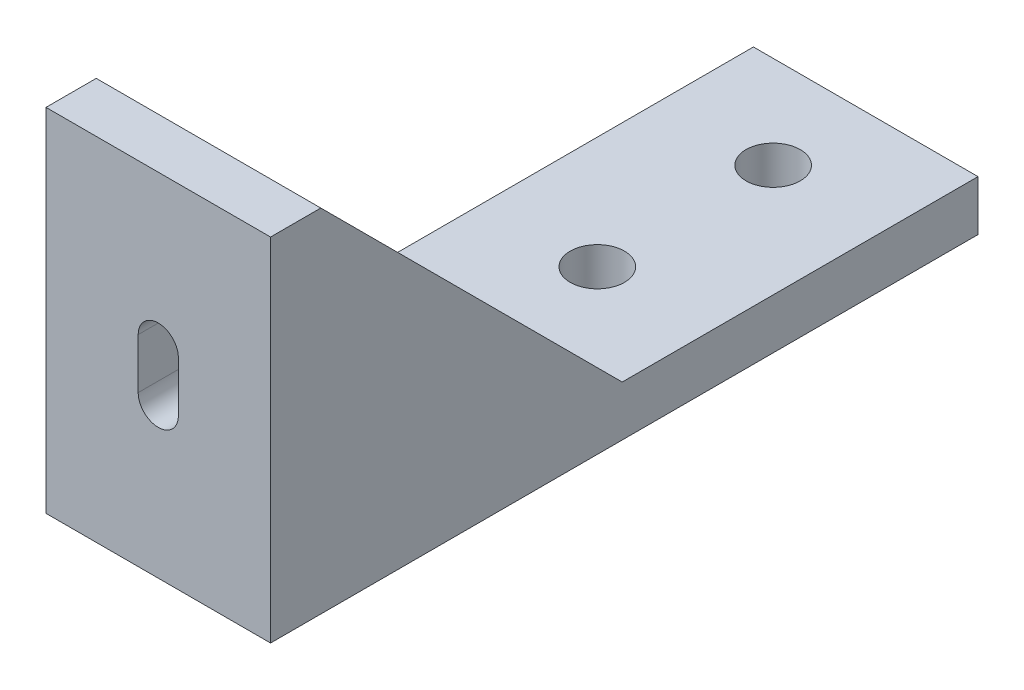
ISO-10303-21;
HEADER;
FILE_DESCRIPTION(('STEP AP214'),'2;1');
FILE_NAME('part.step','',(''),(''),'','','');
FILE_SCHEMA(('AUTOMOTIVE_DESIGN { 1 0 10303 214 1 1 1 1 }'));
ENDSEC;
DATA;
#1=APPLICATION_CONTEXT('core data for automotive mechanical design processes');
#2=APPLICATION_PROTOCOL_DEFINITION('international standard','automotive_design',2000,#1);
#3=PRODUCT_CONTEXT('',#1,'mechanical');
#4=PRODUCT('Part','Part','',(#3));
#5=PRODUCT_RELATED_PRODUCT_CATEGORY('part','',(#4));
#6=PRODUCT_DEFINITION_FORMATION('','',#4);
#7=PRODUCT_DEFINITION_CONTEXT('part definition',#1,'design');
#8=PRODUCT_DEFINITION('design','',#6,#7);
#9=PRODUCT_DEFINITION_SHAPE('','',#8);
#10=(LENGTH_UNIT() NAMED_UNIT(*) SI_UNIT(.MILLI.,.METRE.));
#11=(NAMED_UNIT(*) PLANE_ANGLE_UNIT() SI_UNIT($,.RADIAN.));
#12=(NAMED_UNIT(*) SI_UNIT($,.STERADIAN.) SOLID_ANGLE_UNIT());
#13=UNCERTAINTY_MEASURE_WITH_UNIT(LENGTH_MEASURE(1.E-05),#10,'distance_accuracy_value','');
#14=(GEOMETRIC_REPRESENTATION_CONTEXT(3) GLOBAL_UNCERTAINTY_ASSIGNED_CONTEXT((#13)) GLOBAL_UNIT_ASSIGNED_CONTEXT((#10,
#11,#12)) REPRESENTATION_CONTEXT('',''));
#15=CARTESIAN_POINT('',(0.,0.,0.));
#16=DIRECTION('',(0.,0.,1.));
#17=DIRECTION('',(1.,0.,0.));
#18=AXIS2_PLACEMENT_3D('',#15,#16,#17);
#19=CARTESIAN_POINT('',(0.,5.,0.));
#20=DIRECTION('',(0.,1.,0.));
#21=DIRECTION('',(0.,0.,1.));
#22=AXIS2_PLACEMENT_3D('',#19,#20,#21);
#23=PLANE('',#22);
#24=CARTESIAN_POINT('',(0.666305018695509,5.,-0.826217067206092));
#25=DIRECTION('',(0.,1.,0.));
#26=DIRECTION('',(0.,0.,1.));
#27=AXIS2_PLACEMENT_3D('',#24,#25,#26);
#28=CIRCLE('',#27,2.7);
#29=CARTESIAN_POINT('',(0.666305018695509,5.,1.87378293279391));
#30=VERTEX_POINT('',#29);
#31=EDGE_CURVE('E278',#30,#30,#28,.F.);
#32=ORIENTED_EDGE('',*,*,#31,.T.);
#33=EDGE_LOOP('',(#32));
#34=FACE_BOUND('',#33,.T.);
#35=CARTESIAN_POINT('',(0.666305018695509,5.,-18.3262170672061));
#36=DIRECTION('',(0.,1.,0.));
#37=DIRECTION('',(0.,0.,1.));
#38=AXIS2_PLACEMENT_3D('',#35,#36,#37);
#39=CIRCLE('',#38,2.7);
#40=CARTESIAN_POINT('',(0.666305018695509,5.,-15.6262170672061));
#41=VERTEX_POINT('',#40);
#42=EDGE_CURVE('E293',#41,#41,#39,.F.);
#43=ORIENTED_EDGE('',*,*,#42,.T.);
#44=EDGE_LOOP('',(#43));
#45=FACE_BOUND('',#44,.T.);
#46=DIRECTION('',(0.,0.,-1.));
#47=VECTOR('',#46,1.);
#48=CARTESIAN_POINT('',(11.8423050186955,5.,42.8737829327939));
#49=LINE('',#48,#47);
#50=CARTESIAN_POINT('',(11.8423050186955,4.99999999999999,7.87378293279391));
#51=VERTEX_POINT('',#50);
#52=CARTESIAN_POINT('',(11.8423050186956,4.99999999999999,-27.5406304234461));
#53=VERTEX_POINT('',#52);
#54=EDGE_CURVE('E175',#51,#53,#49,.T.);
#55=ORIENTED_EDGE('',*,*,#54,.T.);
#56=DIRECTION('',(1.,0.,0.));
#57=VECTOR('',#56,1.);
#58=CARTESIAN_POINT('',(11.8423050186956,4.99999999999999,-27.5406304234461));
#59=LINE('',#58,#57);
#60=CARTESIAN_POINT('',(-10.5096949813045,4.99999999999999,-27.5406304234462));
#61=VERTEX_POINT('',#60);
#62=EDGE_CURVE('E142',#61,#53,#59,.T.);
#63=ORIENTED_EDGE('',*,*,#62,.F.);
#64=DIRECTION('',(0.,0.,1.));
#65=VECTOR('',#64,1.);
#66=CARTESIAN_POINT('',(-10.5096949813045,5.,15.8168062638833));
#67=LINE('',#66,#65);
#68=CARTESIAN_POINT('',(-10.5096949813045,4.99999999999999,7.87378293279391));
#69=VERTEX_POINT('',#68);
#70=EDGE_CURVE('E171',#61,#69,#67,.T.);
#71=ORIENTED_EDGE('',*,*,#70,.T.);
#72=DIRECTION('',(-1.,0.,0.));
#73=VECTOR('',#72,1.);
#74=CARTESIAN_POINT('',(-8.5096949813045,4.99999999999999,7.87378293279391));
#75=LINE('',#74,#73);
#76=CARTESIAN_POINT('',(-8.5096949813045,4.99999999999999,7.87378293279391));
#77=VERTEX_POINT('',#76);
#78=EDGE_CURVE('E256',#77,#69,#75,.T.);
#79=ORIENTED_EDGE('',*,*,#78,.F.);
#80=DIRECTION('',(0.,0.,1.));
#81=VECTOR('',#80,1.);
#82=CARTESIAN_POINT('',(-8.5096949813045,4.99999999999999,7.87378293279391));
#83=LINE('',#82,#81);
#84=CARTESIAN_POINT('',(-8.5096949813045,5.,37.8737829327939));
#85=VERTEX_POINT('',#84);
#86=EDGE_CURVE('E270',#77,#85,#83,.T.);
#87=ORIENTED_EDGE('',*,*,#86,.T.);
#88=DIRECTION('',(-1.,0.,0.));
#89=VECTOR('',#88,1.);
#90=CARTESIAN_POINT('',(11.8423050186955,5.,37.8737829327939));
#91=LINE('',#90,#89);
#92=CARTESIAN_POINT('',(9.84230501869551,5.,37.8737829327939));
#93=VERTEX_POINT('',#92);
#94=EDGE_CURVE('E188',#93,#85,#91,.T.);
#95=ORIENTED_EDGE('',*,*,#94,.F.);
#96=DIRECTION('',(0.,0.,-1.));
#97=VECTOR('',#96,1.);
#98=CARTESIAN_POINT('',(9.84230501869551,5.,37.8737829327939));
#99=LINE('',#98,#97);
#100=CARTESIAN_POINT('',(9.84230501869551,4.99999999999999,7.87378293279391));
#101=VERTEX_POINT('',#100);
#102=EDGE_CURVE('E251',#93,#101,#99,.T.);
#103=ORIENTED_EDGE('',*,*,#102,.T.);
#104=DIRECTION('',(1.,0.,0.));
#105=VECTOR('',#104,1.);
#106=CARTESIAN_POINT('',(9.84230501869551,4.99999999999999,7.87378293279391));
#107=LINE('',#106,#105);
#108=EDGE_CURVE('E234',#101,#51,#107,.T.);
#109=ORIENTED_EDGE('',*,*,#108,.T.);
#110=EDGE_LOOP('',(#55,#63,#71,#79,#87,#95,#103,#109));
#111=FACE_BOUND('',#110,.T.);
#112=ADVANCED_FACE('F45',(#34,#45,#111),#23,.T.);
#113=CARTESIAN_POINT('',(0.,0.,0.));
#114=DIRECTION('',(0.,1.,0.));
#115=DIRECTION('',(0.,0.,1.));
#116=AXIS2_PLACEMENT_3D('',#113,#114,#115);
#117=PLANE('',#116);
#118=CARTESIAN_POINT('',(0.666305018695509,0.,-18.3262170672061));
#119=DIRECTION('',(0.,-1.,0.));
#120=DIRECTION('',(0.,0.,-1.));
#121=AXIS2_PLACEMENT_3D('',#118,#119,#120);
#122=CIRCLE('',#121,2.7);
#123=CARTESIAN_POINT('',(0.666305018695509,0.,-21.0262170672061));
#124=VERTEX_POINT('',#123);
#125=EDGE_CURVE('E288',#124,#124,#122,.T.);
#126=ORIENTED_EDGE('',*,*,#125,.F.);
#127=EDGE_LOOP('',(#126));
#128=FACE_BOUND('',#127,.T.);
#129=CARTESIAN_POINT('',(0.666305018695509,0.,-0.826217067206092));
#130=DIRECTION('',(0.,-1.,0.));
#131=DIRECTION('',(0.,0.,-1.));
#132=AXIS2_PLACEMENT_3D('',#129,#130,#131);
#133=CIRCLE('',#132,2.7);
#134=CARTESIAN_POINT('',(0.666305018695509,0.,-3.52621706720609));
#135=VERTEX_POINT('',#134);
#136=EDGE_CURVE('E292',#135,#135,#133,.T.);
#137=ORIENTED_EDGE('',*,*,#136,.F.);
#138=EDGE_LOOP('',(#137));
#139=FACE_BOUND('',#138,.T.);
#140=DIRECTION('',(-1.,0.,0.));
#141=VECTOR('',#140,1.);
#142=CARTESIAN_POINT('',(11.8423050186956,0.,-27.5406304234461));
#143=LINE('',#142,#141);
#144=CARTESIAN_POINT('',(11.8423050186956,0.,-27.5406304234461));
#145=VERTEX_POINT('',#144);
#146=CARTESIAN_POINT('',(-10.5096949813045,0.,-27.5406304234462));
#147=VERTEX_POINT('',#146);
#148=EDGE_CURVE('E61',#145,#147,#143,.T.);
#149=ORIENTED_EDGE('',*,*,#148,.F.);
#150=DIRECTION('',(0.,0.,-1.));
#151=VECTOR('',#150,1.);
#152=CARTESIAN_POINT('',(11.8423050186955,0.,42.8737829327939));
#153=LINE('',#152,#151);
#154=CARTESIAN_POINT('',(11.8423050186955,0.,42.8737829327939));
#155=VERTEX_POINT('',#154);
#156=EDGE_CURVE('E154',#155,#145,#153,.T.);
#157=ORIENTED_EDGE('',*,*,#156,.F.);
#158=DIRECTION('',(1.,0.,0.));
#159=VECTOR('',#158,1.);
#160=CARTESIAN_POINT('',(0.666305018695523,0.,42.8737829327939));
#161=LINE('',#160,#159);
#162=CARTESIAN_POINT('',(-10.5096949813045,0.,42.8737829327939));
#163=VERTEX_POINT('',#162);
#164=EDGE_CURVE('E165',#163,#155,#161,.T.);
#165=ORIENTED_EDGE('',*,*,#164,.F.);
#166=DIRECTION('',(0.,0.,1.));
#167=VECTOR('',#166,1.);
#168=CARTESIAN_POINT('',(-10.5096949813045,0.,15.8168062638833));
#169=LINE('',#168,#167);
#170=EDGE_CURVE('E155',#147,#163,#169,.T.);
#171=ORIENTED_EDGE('',*,*,#170,.F.);
#172=EDGE_LOOP('',(#149,#157,#165,#171));
#173=FACE_BOUND('',#172,.T.);
#174=ADVANCED_FACE('F152',(#128,#139,#173),#117,.F.);
#175=CARTESIAN_POINT('',(11.8423050186955,5.,42.8737829327939));
#176=DIRECTION('',(-1.,0.,0.));
#177=DIRECTION('',(0.,0.,1.));
#178=AXIS2_PLACEMENT_3D('',#175,#176,#177);
#179=PLANE('',#178);
#180=DIRECTION('',(0.,-1.,0.));
#181=VECTOR('',#180,1.);
#182=CARTESIAN_POINT('',(11.8423050186956,4.99999999999999,-27.5406304234461));
#183=LINE('',#182,#181);
#184=EDGE_CURVE('E139',#53,#145,#183,.T.);
#185=ORIENTED_EDGE('',*,*,#184,.F.);
#186=ORIENTED_EDGE('',*,*,#54,.F.);
#187=DIRECTION('',(0.,0.707106781186547,0.707106781186547));
#188=VECTOR('',#187,1.);
#189=CARTESIAN_POINT('',(11.8423050186955,35.,37.8737829327939));
#190=LINE('',#189,#188);
#191=CARTESIAN_POINT('',(11.8423050186955,35.,37.8737829327939));
#192=VERTEX_POINT('',#191);
#193=EDGE_CURVE('E252',#51,#192,#190,.T.);
#194=ORIENTED_EDGE('',*,*,#193,.T.);
#195=DIRECTION('',(0.,0.,-1.));
#196=VECTOR('',#195,1.);
#197=CARTESIAN_POINT('',(11.8423050186955,35.,42.8737829327939));
#198=LINE('',#197,#196);
#199=CARTESIAN_POINT('',(11.8423050186955,35.,42.8737829327939));
#200=VERTEX_POINT('',#199);
#201=EDGE_CURVE('E191',#200,#192,#198,.T.);
#202=ORIENTED_EDGE('',*,*,#201,.F.);
#203=DIRECTION('',(0.,-1.,0.));
#204=VECTOR('',#203,1.);
#205=CARTESIAN_POINT('',(11.8423050186955,5.,42.8737829327939));
#206=LINE('',#205,#204);
#207=EDGE_CURVE('E11',#200,#155,#206,.T.);
#208=ORIENTED_EDGE('',*,*,#207,.T.);
#209=ORIENTED_EDGE('',*,*,#156,.T.);
#210=EDGE_LOOP('',(#185,#186,#194,#202,#208,#209));
#211=FACE_BOUND('',#210,.T.);
#212=ADVANCED_FACE('F47',(#211),#179,.F.);
#213=CARTESIAN_POINT('',(-10.5096949813045,5.,15.8168062638833));
#214=DIRECTION('',(1.,0.,0.));
#215=DIRECTION('',(0.,0.,-1.));
#216=AXIS2_PLACEMENT_3D('',#213,#214,#215);
#217=PLANE('',#216);
#218=DIRECTION('',(0.,1.,0.));
#219=VECTOR('',#218,1.);
#220=CARTESIAN_POINT('',(-10.5096949813045,4.99999999999999,-27.5406304234462));
#221=LINE('',#220,#219);
#222=EDGE_CURVE('E157',#147,#61,#221,.T.);
#223=ORIENTED_EDGE('',*,*,#222,.F.);
#224=ORIENTED_EDGE('',*,*,#170,.T.);
#225=DIRECTION('',(0.,-1.,0.));
#226=VECTOR('',#225,1.);
#227=CARTESIAN_POINT('',(-10.5096949813045,5.,42.8737829327939));
#228=LINE('',#227,#226);
#229=CARTESIAN_POINT('',(-10.5096949813045,35.,42.8737829327939));
#230=VERTEX_POINT('',#229);
#231=EDGE_CURVE('E54',#230,#163,#228,.T.);
#232=ORIENTED_EDGE('',*,*,#231,.F.);
#233=DIRECTION('',(0.,0.,1.));
#234=VECTOR('',#233,1.);
#235=CARTESIAN_POINT('',(-10.5096949813045,35.,42.8737829327939));
#236=LINE('',#235,#234);
#237=CARTESIAN_POINT('',(-10.5096949813045,35.,37.8737829327939));
#238=VERTEX_POINT('',#237);
#239=EDGE_CURVE('E168',#238,#230,#236,.T.);
#240=ORIENTED_EDGE('',*,*,#239,.F.);
#241=DIRECTION('',(0.,-0.707106781186547,-0.707106781186547));
#242=VECTOR('',#241,1.);
#243=CARTESIAN_POINT('',(-10.5096949813045,35.,37.8737829327939));
#244=LINE('',#243,#242);
#245=EDGE_CURVE('E273',#238,#69,#244,.T.);
#246=ORIENTED_EDGE('',*,*,#245,.T.);
#247=ORIENTED_EDGE('',*,*,#70,.F.);
#248=EDGE_LOOP('',(#223,#224,#232,#240,#246,#247));
#249=FACE_BOUND('',#248,.T.);
#250=ADVANCED_FACE('F307',(#249),#217,.F.);
#251=CARTESIAN_POINT('',(11.8423050186955,35.,37.8737829327939));
#252=DIRECTION('',(0.,0.,1.));
#253=DIRECTION('',(1.,0.,0.));
#254=AXIS2_PLACEMENT_3D('',#251,#252,#253);
#255=PLANE('',#254);
#256=CARTESIAN_POINT('',(0.666305018695497,15.,37.8737829327939));
#257=DIRECTION('',(0.,0.,-1.));
#258=DIRECTION('',(-1.,0.,0.));
#259=AXIS2_PLACEMENT_3D('',#256,#257,#258);
#260=CIRCLE('',#259,2.);
#261=CARTESIAN_POINT('',(2.6663050186955,15.,37.8737829327939));
#262=VERTEX_POINT('',#261);
#263=CARTESIAN_POINT('',(-1.3336949813045,15.,37.8737829327939));
#264=VERTEX_POINT('',#263);
#265=EDGE_CURVE('E227',#262,#264,#260,.T.);
#266=ORIENTED_EDGE('',*,*,#265,.F.);
#267=DIRECTION('',(0.,-1.,0.));
#268=VECTOR('',#267,1.);
#269=CARTESIAN_POINT('',(2.66630501869549,0.,37.8737829327939));
#270=LINE('',#269,#268);
#271=CARTESIAN_POINT('',(2.6663050186955,20.,37.8737829327939));
#272=VERTEX_POINT('',#271);
#273=EDGE_CURVE('E231',#272,#262,#270,.T.);
#274=ORIENTED_EDGE('',*,*,#273,.F.);
#275=CARTESIAN_POINT('',(0.666305018695497,20.,37.8737829327939));
#276=DIRECTION('',(0.,0.,-1.));
#277=DIRECTION('',(-1.,0.,0.));
#278=AXIS2_PLACEMENT_3D('',#275,#276,#277);
#279=CIRCLE('',#278,2.);
#280=CARTESIAN_POINT('',(-1.3336949813045,20.,37.8737829327939));
#281=VERTEX_POINT('',#280);
#282=EDGE_CURVE('E218',#281,#272,#279,.T.);
#283=ORIENTED_EDGE('',*,*,#282,.F.);
#284=DIRECTION('',(0.,-1.,0.));
#285=VECTOR('',#284,1.);
#286=CARTESIAN_POINT('',(-1.3336949813045,0.,37.8737829327939));
#287=LINE('',#286,#285);
#288=EDGE_CURVE('E223',#281,#264,#287,.T.);
#289=ORIENTED_EDGE('',*,*,#288,.T.);
#290=EDGE_LOOP('',(#266,#274,#283,#289));
#291=FACE_BOUND('',#290,.T.);
#292=ORIENTED_EDGE('',*,*,#94,.T.);
#293=DIRECTION('',(0.,1.,0.));
#294=VECTOR('',#293,1.);
#295=CARTESIAN_POINT('',(-8.5096949813045,5.,37.8737829327939));
#296=LINE('',#295,#294);
#297=CARTESIAN_POINT('',(-8.5096949813045,35.,37.8737829327939));
#298=VERTEX_POINT('',#297);
#299=EDGE_CURVE('E277',#85,#298,#296,.T.);
#300=ORIENTED_EDGE('',*,*,#299,.T.);
#301=DIRECTION('',(-1.,0.,0.));
#302=VECTOR('',#301,1.);
#303=CARTESIAN_POINT('',(11.8423050186955,35.,37.8737829327939));
#304=LINE('',#303,#302);
#305=CARTESIAN_POINT('',(9.84230501869551,35.,37.8737829327939));
#306=VERTEX_POINT('',#305);
#307=EDGE_CURVE('E201',#306,#298,#304,.T.);
#308=ORIENTED_EDGE('',*,*,#307,.F.);
#309=DIRECTION('',(0.,-1.,0.));
#310=VECTOR('',#309,1.);
#311=CARTESIAN_POINT('',(9.84230501869551,35.,37.8737829327939));
#312=LINE('',#311,#310);
#313=EDGE_CURVE('E260',#306,#93,#312,.T.);
#314=ORIENTED_EDGE('',*,*,#313,.T.);
#315=EDGE_LOOP('',(#292,#300,#308,#314));
#316=FACE_BOUND('',#315,.T.);
#317=ADVANCED_FACE('F318',(#291,#316),#255,.F.);
#318=CARTESIAN_POINT('',(0.666305018695523,5.,42.8737829327939));
#319=DIRECTION('',(0.,0.,-1.));
#320=DIRECTION('',(-1.,0.,0.));
#321=AXIS2_PLACEMENT_3D('',#318,#319,#320);
#322=PLANE('',#321);
#323=CARTESIAN_POINT('',(0.666305018695497,20.,42.8737829327939));
#324=DIRECTION('',(0.,0.,-1.));
#325=DIRECTION('',(-1.,0.,0.));
#326=AXIS2_PLACEMENT_3D('',#323,#324,#325);
#327=CIRCLE('',#326,2.);
#328=CARTESIAN_POINT('',(-1.3336949813045,20.,42.8737829327939));
#329=VERTEX_POINT('',#328);
#330=CARTESIAN_POINT('',(2.6663050186955,20.,42.8737829327939));
#331=VERTEX_POINT('',#330);
#332=EDGE_CURVE('E210',#329,#331,#327,.T.);
#333=ORIENTED_EDGE('',*,*,#332,.T.);
#334=DIRECTION('',(0.,-1.,0.));
#335=VECTOR('',#334,1.);
#336=CARTESIAN_POINT('',(2.66630501869549,0.,42.8737829327939));
#337=LINE('',#336,#335);
#338=CARTESIAN_POINT('',(2.6663050186955,15.,42.8737829327939));
#339=VERTEX_POINT('',#338);
#340=EDGE_CURVE('E222',#331,#339,#337,.T.);
#341=ORIENTED_EDGE('',*,*,#340,.T.);
#342=CARTESIAN_POINT('',(0.666305018695497,15.,42.8737829327939));
#343=DIRECTION('',(0.,0.,-1.));
#344=DIRECTION('',(-1.,0.,0.));
#345=AXIS2_PLACEMENT_3D('',#342,#343,#344);
#346=CIRCLE('',#345,2.);
#347=CARTESIAN_POINT('',(-1.3336949813045,15.,42.8737829327939));
#348=VERTEX_POINT('',#347);
#349=EDGE_CURVE('E242',#339,#348,#346,.T.);
#350=ORIENTED_EDGE('',*,*,#349,.T.);
#351=DIRECTION('',(0.,-1.,0.));
#352=VECTOR('',#351,1.);
#353=CARTESIAN_POINT('',(-1.3336949813045,0.,42.8737829327939));
#354=LINE('',#353,#352);
#355=EDGE_CURVE('E238',#329,#348,#354,.T.);
#356=ORIENTED_EDGE('',*,*,#355,.F.);
#357=EDGE_LOOP('',(#333,#341,#350,#356));
#358=FACE_BOUND('',#357,.T.);
#359=ORIENTED_EDGE('',*,*,#164,.T.);
#360=ORIENTED_EDGE('',*,*,#207,.F.);
#361=DIRECTION('',(1.,0.,0.));
#362=VECTOR('',#361,1.);
#363=CARTESIAN_POINT('',(11.8423050186955,35.,42.8737829327939));
#364=LINE('',#363,#362);
#365=EDGE_CURVE('E161',#230,#200,#364,.T.);
#366=ORIENTED_EDGE('',*,*,#365,.F.);
#367=ORIENTED_EDGE('',*,*,#231,.T.);
#368=EDGE_LOOP('',(#359,#360,#366,#367));
#369=FACE_BOUND('',#368,.T.);
#370=ADVANCED_FACE('F349',(#358,#369),#322,.F.);
#371=CARTESIAN_POINT('',(0.,35.,0.));
#372=DIRECTION('',(0.,1.,0.));
#373=DIRECTION('',(0.,0.,1.));
#374=AXIS2_PLACEMENT_3D('',#371,#372,#373);
#375=PLANE('',#374);
#376=ORIENTED_EDGE('',*,*,#201,.T.);
#377=EDGE_CURVE('E197',#192,#306,#304,.T.);
#378=ORIENTED_EDGE('',*,*,#377,.T.);
#379=ORIENTED_EDGE('',*,*,#307,.T.);
#380=DIRECTION('',(-1.,0.,0.));
#381=VECTOR('',#380,1.);
#382=CARTESIAN_POINT('',(-8.5096949813045,35.,37.8737829327939));
#383=LINE('',#382,#381);
#384=EDGE_CURVE('E266',#298,#238,#383,.T.);
#385=ORIENTED_EDGE('',*,*,#384,.T.);
#386=ORIENTED_EDGE('',*,*,#239,.T.);
#387=ORIENTED_EDGE('',*,*,#365,.T.);
#388=EDGE_LOOP('',(#376,#378,#379,#385,#386,#387));
#389=FACE_BOUND('',#388,.T.);
#390=ADVANCED_FACE('F314',(#389),#375,.T.);
#391=CARTESIAN_POINT('',(2.66630501869549,0.,42.8737829327939));
#392=DIRECTION('',(1.,0.,0.));
#393=DIRECTION('',(0.,1.,0.));
#394=AXIS2_PLACEMENT_3D('',#391,#392,#393);
#395=PLANE('',#394);
#396=ORIENTED_EDGE('',*,*,#273,.T.);
#397=DIRECTION('',(0.,0.,-1.));
#398=VECTOR('',#397,1.);
#399=CARTESIAN_POINT('',(2.6663050186955,15.,42.8737829327939));
#400=LINE('',#399,#398);
#401=EDGE_CURVE('E205',#339,#262,#400,.T.);
#402=ORIENTED_EDGE('',*,*,#401,.F.);
#403=ORIENTED_EDGE('',*,*,#340,.F.);
#404=DIRECTION('',(0.,0.,-1.));
#405=VECTOR('',#404,1.);
#406=CARTESIAN_POINT('',(2.6663050186955,20.,42.8737829327939));
#407=LINE('',#406,#405);
#408=EDGE_CURVE('E192',#331,#272,#407,.T.);
#409=ORIENTED_EDGE('',*,*,#408,.T.);
#410=EDGE_LOOP('',(#396,#402,#403,#409));
#411=FACE_BOUND('',#410,.T.);
#412=ADVANCED_FACE('F476',(#411),#395,.F.);
#413=CARTESIAN_POINT('',(0.666305018695497,20.,42.8737829327939));
#414=DIRECTION('',(0.,0.,-1.));
#415=DIRECTION('',(-1.,0.,0.));
#416=AXIS2_PLACEMENT_3D('',#413,#414,#415);
#417=CYLINDRICAL_SURFACE('',#416,2.);
#418=ORIENTED_EDGE('',*,*,#282,.T.);
#419=ORIENTED_EDGE('',*,*,#408,.F.);
#420=ORIENTED_EDGE('',*,*,#332,.F.);
#421=DIRECTION('',(0.,0.,-1.));
#422=VECTOR('',#421,1.);
#423=CARTESIAN_POINT('',(-1.3336949813045,20.,42.8737829327939));
#424=LINE('',#423,#422);
#425=EDGE_CURVE('E213',#329,#281,#424,.T.);
#426=ORIENTED_EDGE('',*,*,#425,.T.);
#427=EDGE_LOOP('',(#418,#419,#420,#426));
#428=FACE_BOUND('',#427,.T.);
#429=ADVANCED_FACE('F467',(#428),#417,.F.);
#430=CARTESIAN_POINT('',(-1.3336949813045,0.,42.8737829327939));
#431=DIRECTION('',(1.,0.,0.));
#432=DIRECTION('',(0.,1.,0.));
#433=AXIS2_PLACEMENT_3D('',#430,#431,#432);
#434=PLANE('',#433);
#435=ORIENTED_EDGE('',*,*,#288,.F.);
#436=ORIENTED_EDGE('',*,*,#425,.F.);
#437=ORIENTED_EDGE('',*,*,#355,.T.);
#438=DIRECTION('',(0.,0.,-1.));
#439=VECTOR('',#438,1.);
#440=CARTESIAN_POINT('',(-1.3336949813045,15.,42.8737829327939));
#441=LINE('',#440,#439);
#442=EDGE_CURVE('E209',#348,#264,#441,.T.);
#443=ORIENTED_EDGE('',*,*,#442,.T.);
#444=EDGE_LOOP('',(#435,#436,#437,#443));
#445=FACE_BOUND('',#444,.T.);
#446=ADVANCED_FACE('F458',(#445),#434,.T.);
#447=CARTESIAN_POINT('',(0.666305018695497,15.,42.8737829327939));
#448=DIRECTION('',(0.,0.,-1.));
#449=DIRECTION('',(-1.,0.,0.));
#450=AXIS2_PLACEMENT_3D('',#447,#448,#449);
#451=CYLINDRICAL_SURFACE('',#450,2.);
#452=ORIENTED_EDGE('',*,*,#265,.T.);
#453=ORIENTED_EDGE('',*,*,#442,.F.);
#454=ORIENTED_EDGE('',*,*,#349,.F.);
#455=ORIENTED_EDGE('',*,*,#401,.T.);
#456=EDGE_LOOP('',(#452,#453,#454,#455));
#457=FACE_BOUND('',#456,.T.);
#458=ADVANCED_FACE('F334',(#457),#451,.F.);
#459=CARTESIAN_POINT('',(9.84230501869551,35.,37.8737829327939));
#460=DIRECTION('',(0.,0.707106781186547,-0.707106781186547));
#461=DIRECTION('',(0.,0.707106781186548,0.707106781186548));
#462=AXIS2_PLACEMENT_3D('',#459,#460,#461);
#463=PLANE('',#462);
#464=ORIENTED_EDGE('',*,*,#193,.F.);
#465=ORIENTED_EDGE('',*,*,#108,.F.);
#466=DIRECTION('',(0.,0.707106781186547,0.707106781186547));
#467=VECTOR('',#466,1.);
#468=CARTESIAN_POINT('',(9.84230501869551,35.,37.8737829327939));
#469=LINE('',#468,#467);
#470=EDGE_CURVE('E69',#101,#306,#469,.T.);
#471=ORIENTED_EDGE('',*,*,#470,.T.);
#472=ORIENTED_EDGE('',*,*,#377,.F.);
#473=EDGE_LOOP('',(#464,#465,#471,#472));
#474=FACE_BOUND('',#473,.T.);
#475=ADVANCED_FACE('F326',(#474),#463,.T.);
#476=CARTESIAN_POINT('',(9.84230501869551,0.,0.));
#477=DIRECTION('',(1.,0.,0.));
#478=DIRECTION('',(0.,0.,-1.));
#479=AXIS2_PLACEMENT_3D('',#476,#477,#478);
#480=PLANE('',#479);
#481=ORIENTED_EDGE('',*,*,#470,.F.);
#482=ORIENTED_EDGE('',*,*,#102,.F.);
#483=ORIENTED_EDGE('',*,*,#313,.F.);
#484=EDGE_LOOP('',(#481,#482,#483));
#485=FACE_BOUND('',#484,.T.);
#486=ADVANCED_FACE('F324',(#485),#480,.F.);
#487=CARTESIAN_POINT('',(-8.5096949813045,35.,37.8737829327939));
#488=DIRECTION('',(0.,0.707106781186547,-0.707106781186547));
#489=DIRECTION('',(0.,0.707106781186548,0.707106781186548));
#490=AXIS2_PLACEMENT_3D('',#487,#488,#489);
#491=PLANE('',#490);
#492=ORIENTED_EDGE('',*,*,#245,.F.);
#493=ORIENTED_EDGE('',*,*,#384,.F.);
#494=DIRECTION('',(0.,-0.707106781186547,-0.707106781186547));
#495=VECTOR('',#494,1.);
#496=CARTESIAN_POINT('',(-8.5096949813045,35.,37.8737829327939));
#497=LINE('',#496,#495);
#498=EDGE_CURVE('E282',#298,#77,#497,.T.);
#499=ORIENTED_EDGE('',*,*,#498,.T.);
#500=ORIENTED_EDGE('',*,*,#78,.T.);
#501=EDGE_LOOP('',(#492,#493,#499,#500));
#502=FACE_BOUND('',#501,.T.);
#503=ADVANCED_FACE('F310',(#502),#491,.T.);
#504=CARTESIAN_POINT('',(-8.5096949813045,0.,0.));
#505=DIRECTION('',(1.,0.,0.));
#506=DIRECTION('',(0.,0.,-1.));
#507=AXIS2_PLACEMENT_3D('',#504,#505,#506);
#508=PLANE('',#507);
#509=ORIENTED_EDGE('',*,*,#299,.F.);
#510=ORIENTED_EDGE('',*,*,#86,.F.);
#511=ORIENTED_EDGE('',*,*,#498,.F.);
#512=EDGE_LOOP('',(#509,#510,#511));
#513=FACE_BOUND('',#512,.T.);
#514=ADVANCED_FACE('F322',(#513),#508,.T.);
#515=CARTESIAN_POINT('',(0.666305018695509,12.6367532368147,-18.3262170672061));
#516=DIRECTION('',(0.,-1.,0.));
#517=DIRECTION('',(0.,0.,-1.));
#518=AXIS2_PLACEMENT_3D('',#515,#516,#517);
#519=CYLINDRICAL_SURFACE('',#518,2.7);
#520=ORIENTED_EDGE('',*,*,#125,.T.);
#521=EDGE_LOOP('',(#520));
#522=FACE_BOUND('',#521,.T.);
#523=ORIENTED_EDGE('',*,*,#42,.F.);
#524=EDGE_LOOP('',(#523));
#525=FACE_BOUND('',#524,.T.);
#526=ADVANCED_FACE('F382',(#522,#525),#519,.F.);
#527=CARTESIAN_POINT('',(0.666305018695509,12.6367532368147,-0.826217067206092));
#528=DIRECTION('',(0.,-1.,0.));
#529=DIRECTION('',(0.,0.,-1.));
#530=AXIS2_PLACEMENT_3D('',#527,#528,#529);
#531=CYLINDRICAL_SURFACE('',#530,2.7);
#532=ORIENTED_EDGE('',*,*,#136,.T.);
#533=EDGE_LOOP('',(#532));
#534=FACE_BOUND('',#533,.T.);
#535=ORIENTED_EDGE('',*,*,#31,.F.);
#536=EDGE_LOOP('',(#535));
#537=FACE_BOUND('',#536,.T.);
#538=ADVANCED_FACE('F377',(#534,#537),#531,.F.);
#539=CARTESIAN_POINT('',(0.,0.,-27.5406304234461));
#540=DIRECTION('',(0.,0.,-1.));
#541=DIRECTION('',(-1.,0.,0.));
#542=AXIS2_PLACEMENT_3D('',#539,#540,#541);
#543=PLANE('',#542);
#544=ORIENTED_EDGE('',*,*,#184,.T.);
#545=ORIENTED_EDGE('',*,*,#148,.T.);
#546=ORIENTED_EDGE('',*,*,#222,.T.);
#547=ORIENTED_EDGE('',*,*,#62,.T.);
#548=EDGE_LOOP('',(#544,#545,#546,#547));
#549=FACE_BOUND('',#548,.T.);
#550=ADVANCED_FACE('F140',(#549),#543,.T.);
#551=CLOSED_SHELL('',(#112,#174,#212,#250,#317,#370,#390,#412,#429,#446,#458,#475,#486,#503,
#514,#526,#538,#550));
#552=MANIFOLD_SOLID_BREP('B2',#551);
#553=ADVANCED_BREP_SHAPE_REPRESENTATION('',(#18,#552),#14);
#554=SHAPE_DEFINITION_REPRESENTATION(#9,#553);
ENDSEC;
END-ISO-10303-21;
